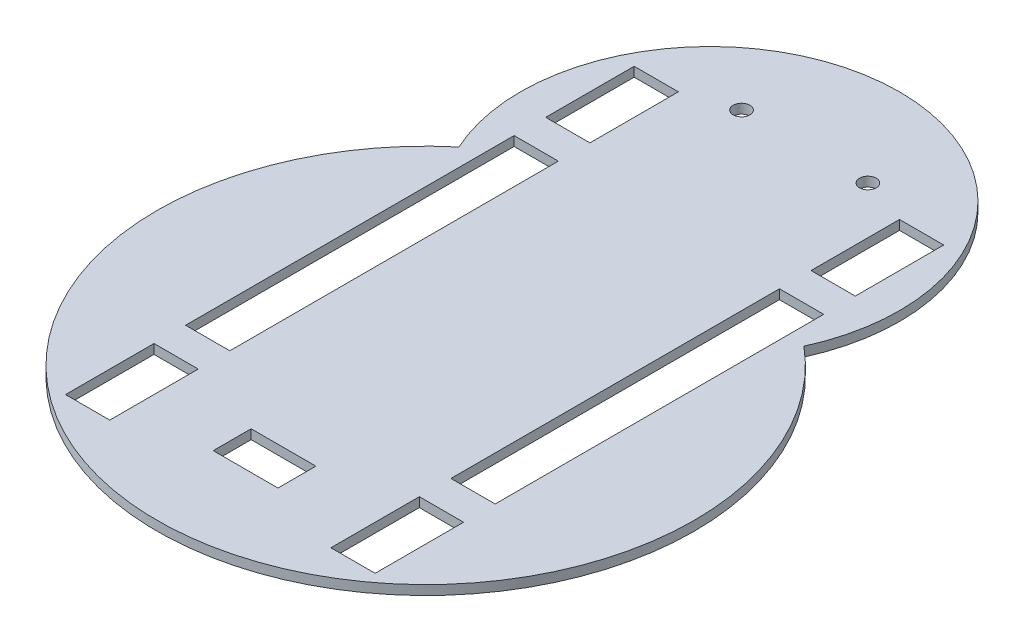
ISO-10303-21;
HEADER;
FILE_DESCRIPTION(('STEP AP214'),'2;1');
FILE_NAME('part.step','',(''),(''),'','','');
FILE_SCHEMA(('AUTOMOTIVE_DESIGN { 1 0 10303 214 1 1 1 1 }'));
ENDSEC;
DATA;
#1=APPLICATION_CONTEXT('core data for automotive mechanical design processes');
#2=APPLICATION_PROTOCOL_DEFINITION('international standard','automotive_design',2000,#1);
#3=PRODUCT_CONTEXT('',#1,'mechanical');
#4=PRODUCT('Part','Part','',(#3));
#5=PRODUCT_RELATED_PRODUCT_CATEGORY('part','',(#4));
#6=PRODUCT_DEFINITION_FORMATION('','',#4);
#7=PRODUCT_DEFINITION_CONTEXT('part definition',#1,'design');
#8=PRODUCT_DEFINITION('design','',#6,#7);
#9=PRODUCT_DEFINITION_SHAPE('','',#8);
#10=(LENGTH_UNIT() NAMED_UNIT(*) SI_UNIT(.MILLI.,.METRE.));
#11=(NAMED_UNIT(*) PLANE_ANGLE_UNIT() SI_UNIT($,.RADIAN.));
#12=(NAMED_UNIT(*) SI_UNIT($,.STERADIAN.) SOLID_ANGLE_UNIT());
#13=UNCERTAINTY_MEASURE_WITH_UNIT(LENGTH_MEASURE(1.E-05),#10,'distance_accuracy_value','');
#14=(GEOMETRIC_REPRESENTATION_CONTEXT(3) GLOBAL_UNCERTAINTY_ASSIGNED_CONTEXT((#13)) GLOBAL_UNIT_ASSIGNED_CONTEXT((#10,
#11,#12)) REPRESENTATION_CONTEXT('',''));
#15=CARTESIAN_POINT('',(0.,0.,0.));
#16=DIRECTION('',(0.,0.,1.));
#17=DIRECTION('',(1.,0.,0.));
#18=AXIS2_PLACEMENT_3D('',#15,#16,#17);
#19=CARTESIAN_POINT('',(-49.,1.5,0.));
#20=DIRECTION('',(-1.,0.,0.));
#21=DIRECTION('',(0.,0.,1.));
#22=AXIS2_PLACEMENT_3D('',#19,#20,#21);
#23=PLANE('',#22);
#24=DIRECTION('',(0.,0.,-1.));
#25=VECTOR('',#24,1.);
#26=CARTESIAN_POINT('',(-49.,1.5,0.));
#27=LINE('',#26,#25);
#28=CARTESIAN_POINT('',(-49.,1.5,27.));
#29=VERTEX_POINT('',#28);
#30=CARTESIAN_POINT('',(-49.,1.5,-77.));
#31=VERTEX_POINT('',#30);
#32=EDGE_CURVE('E365',#29,#31,#27,.T.);
#33=ORIENTED_EDGE('',*,*,#32,.F.);
#34=DIRECTION('',(0.,-1.,0.));
#35=VECTOR('',#34,1.);
#36=CARTESIAN_POINT('',(-49.,1.5,27.));
#37=LINE('',#36,#35);
#38=CARTESIAN_POINT('',(-49.,-1.5,27.));
#39=VERTEX_POINT('',#38);
#40=EDGE_CURVE('E461',#29,#39,#37,.T.);
#41=ORIENTED_EDGE('',*,*,#40,.T.);
#42=DIRECTION('',(0.,0.,-1.));
#43=VECTOR('',#42,1.);
#44=CARTESIAN_POINT('',(-49.,-1.5,0.));
#45=LINE('',#44,#43);
#46=CARTESIAN_POINT('',(-49.,-1.5,-77.));
#47=VERTEX_POINT('',#46);
#48=EDGE_CURVE('E404',#39,#47,#45,.T.);
#49=ORIENTED_EDGE('',*,*,#48,.T.);
#50=DIRECTION('',(0.,-1.,0.));
#51=VECTOR('',#50,1.);
#52=CARTESIAN_POINT('',(-49.,1.5,-77.));
#53=LINE('',#52,#51);
#54=EDGE_CURVE('E455',#31,#47,#53,.T.);
#55=ORIENTED_EDGE('',*,*,#54,.F.);
#56=EDGE_LOOP('',(#33,#41,#49,#55));
#57=FACE_BOUND('',#56,.T.);
#58=ADVANCED_FACE('F107',(#57),#23,.F.);
#59=CARTESIAN_POINT('',(-49.,1.5,-87.));
#60=VERTEX_POINT('',#59);
#61=CARTESIAN_POINT('',(-49.,1.5,-115.));
#62=VERTEX_POINT('',#61);
#63=EDGE_CURVE('E359',#60,#62,#27,.T.);
#64=ORIENTED_EDGE('',*,*,#63,.F.);
#65=DIRECTION('',(0.,-1.,0.));
#66=VECTOR('',#65,1.);
#67=CARTESIAN_POINT('',(-49.0000000000001,1.5,-87.));
#68=LINE('',#67,#66);
#69=CARTESIAN_POINT('',(-49.,-1.5,-87.));
#70=VERTEX_POINT('',#69);
#71=EDGE_CURVE('E457',#60,#70,#68,.T.);
#72=ORIENTED_EDGE('',*,*,#71,.T.);
#73=CARTESIAN_POINT('',(-49.,-1.5,-115.));
#74=VERTEX_POINT('',#73);
#75=EDGE_CURVE('E398',#70,#74,#45,.T.);
#76=ORIENTED_EDGE('',*,*,#75,.T.);
#77=DIRECTION('',(0.,-1.,0.));
#78=VECTOR('',#77,1.);
#79=CARTESIAN_POINT('',(-49.,1.5,-115.));
#80=LINE('',#79,#78);
#81=EDGE_CURVE('E422',#62,#74,#80,.T.);
#82=ORIENTED_EDGE('',*,*,#81,.F.);
#83=EDGE_LOOP('',(#64,#72,#76,#82));
#84=FACE_BOUND('',#83,.T.);
#85=ADVANCED_FACE('F591',(#84),#23,.F.);
#86=CARTESIAN_POINT('',(0.,1.5,-115.));
#87=DIRECTION('',(0.,0.,-1.));
#88=DIRECTION('',(-1.,0.,0.));
#89=AXIS2_PLACEMENT_3D('',#86,#87,#88);
#90=PLANE('',#89);
#91=DIRECTION('',(1.,0.,0.));
#92=VECTOR('',#91,1.);
#93=CARTESIAN_POINT('',(0.,-1.5,-115.));
#94=LINE('',#93,#92);
#95=CARTESIAN_POINT('',(-35.,-1.5,-115.));
#96=VERTEX_POINT('',#95);
#97=EDGE_CURVE('E403',#74,#96,#94,.T.);
#98=ORIENTED_EDGE('',*,*,#97,.T.);
#99=DIRECTION('',(0.,-1.,0.));
#100=VECTOR('',#99,1.);
#101=CARTESIAN_POINT('',(-35.,1.5,-115.));
#102=LINE('',#101,#100);
#103=CARTESIAN_POINT('',(-35.,1.5,-115.));
#104=VERTEX_POINT('',#103);
#105=EDGE_CURVE('E419',#104,#96,#102,.T.);
#106=ORIENTED_EDGE('',*,*,#105,.F.);
#107=DIRECTION('',(1.,0.,0.));
#108=VECTOR('',#107,1.);
#109=CARTESIAN_POINT('',(0.,1.5,-115.));
#110=LINE('',#109,#108);
#111=EDGE_CURVE('E364',#62,#104,#110,.T.);
#112=ORIENTED_EDGE('',*,*,#111,.F.);
#113=ORIENTED_EDGE('',*,*,#81,.T.);
#114=EDGE_LOOP('',(#98,#106,#112,#113));
#115=FACE_BOUND('',#114,.T.);
#116=ADVANCED_FACE('F590',(#115),#90,.F.);
#117=CARTESIAN_POINT('',(-35.,1.5,0.));
#118=DIRECTION('',(-1.,0.,0.));
#119=DIRECTION('',(0.,0.,1.));
#120=AXIS2_PLACEMENT_3D('',#117,#118,#119);
#121=PLANE('',#120);
#122=DIRECTION('',(0.,-1.,0.));
#123=VECTOR('',#122,1.);
#124=CARTESIAN_POINT('',(-35.,1.5,-87.));
#125=LINE('',#124,#123);
#126=CARTESIAN_POINT('',(-35.,1.5,-87.));
#127=VERTEX_POINT('',#126);
#128=CARTESIAN_POINT('',(-35.,-1.5,-87.));
#129=VERTEX_POINT('',#128);
#130=EDGE_CURVE('E478',#127,#129,#125,.T.);
#131=ORIENTED_EDGE('',*,*,#130,.F.);
#132=DIRECTION('',(0.,0.,-1.));
#133=VECTOR('',#132,1.);
#134=CARTESIAN_POINT('',(-35.,1.5,0.));
#135=LINE('',#134,#133);
#136=EDGE_CURVE('E368',#127,#104,#135,.T.);
#137=ORIENTED_EDGE('',*,*,#136,.T.);
#138=ORIENTED_EDGE('',*,*,#105,.T.);
#139=DIRECTION('',(0.,0.,-1.));
#140=VECTOR('',#139,1.);
#141=CARTESIAN_POINT('',(-35.,-1.5,0.));
#142=LINE('',#141,#140);
#143=EDGE_CURVE('E407',#129,#96,#142,.T.);
#144=ORIENTED_EDGE('',*,*,#143,.F.);
#145=EDGE_LOOP('',(#131,#137,#138,#144));
#146=FACE_BOUND('',#145,.T.);
#147=ADVANCED_FACE('F599',(#146),#121,.T.);
#148=DIRECTION('',(0.,-1.,0.));
#149=VECTOR('',#148,1.);
#150=CARTESIAN_POINT('',(-35.,1.5,27.));
#151=LINE('',#150,#149);
#152=CARTESIAN_POINT('',(-35.,1.5,27.));
#153=VERTEX_POINT('',#152);
#154=CARTESIAN_POINT('',(-35.,-1.5,27.));
#155=VERTEX_POINT('',#154);
#156=EDGE_CURVE('E458',#153,#155,#151,.T.);
#157=ORIENTED_EDGE('',*,*,#156,.F.);
#158=CARTESIAN_POINT('',(-35.,1.5,-77.));
#159=VERTEX_POINT('',#158);
#160=EDGE_CURVE('E373',#153,#159,#135,.T.);
#161=ORIENTED_EDGE('',*,*,#160,.T.);
#162=DIRECTION('',(0.,-1.,0.));
#163=VECTOR('',#162,1.);
#164=CARTESIAN_POINT('',(-35.,1.5,-77.));
#165=LINE('',#164,#163);
#166=CARTESIAN_POINT('',(-35.,-1.5,-77.));
#167=VERTEX_POINT('',#166);
#168=EDGE_CURVE('E454',#159,#167,#165,.T.);
#169=ORIENTED_EDGE('',*,*,#168,.T.);
#170=EDGE_CURVE('E411',#155,#167,#142,.T.);
#171=ORIENTED_EDGE('',*,*,#170,.F.);
#172=EDGE_LOOP('',(#157,#161,#169,#171));
#173=FACE_BOUND('',#172,.T.);
#174=ADVANCED_FACE('F631',(#173),#121,.T.);
#175=CARTESIAN_POINT('',(-35.,1.5,65.));
#176=VERTEX_POINT('',#175);
#177=CARTESIAN_POINT('',(-35.,1.5,37.));
#178=VERTEX_POINT('',#177);
#179=EDGE_CURVE('E369',#176,#178,#135,.T.);
#180=ORIENTED_EDGE('',*,*,#179,.T.);
#181=DIRECTION('',(0.,-1.,0.));
#182=VECTOR('',#181,1.);
#183=CARTESIAN_POINT('',(-35.,1.5,37.));
#184=LINE('',#183,#182);
#185=CARTESIAN_POINT('',(-35.,-1.5,37.));
#186=VERTEX_POINT('',#185);
#187=EDGE_CURVE('E476',#178,#186,#184,.T.);
#188=ORIENTED_EDGE('',*,*,#187,.T.);
#189=CARTESIAN_POINT('',(-35.,-1.5,65.));
#190=VERTEX_POINT('',#189);
#191=EDGE_CURVE('E408',#190,#186,#142,.T.);
#192=ORIENTED_EDGE('',*,*,#191,.F.);
#193=DIRECTION('',(0.,-1.,0.));
#194=VECTOR('',#193,1.);
#195=CARTESIAN_POINT('',(-35.,1.5,65.));
#196=LINE('',#195,#194);
#197=EDGE_CURVE('E416',#176,#190,#196,.T.);
#198=ORIENTED_EDGE('',*,*,#197,.F.);
#199=EDGE_LOOP('',(#180,#188,#192,#198));
#200=FACE_BOUND('',#199,.T.);
#201=ADVANCED_FACE('F614',(#200),#121,.T.);
#202=CARTESIAN_POINT('',(0.,1.5,65.));
#203=DIRECTION('',(0.,0.,-1.));
#204=DIRECTION('',(-1.,0.,0.));
#205=AXIS2_PLACEMENT_3D('',#202,#203,#204);
#206=PLANE('',#205);
#207=DIRECTION('',(1.,0.,0.));
#208=VECTOR('',#207,1.);
#209=CARTESIAN_POINT('',(0.,-1.5,65.));
#210=LINE('',#209,#208);
#211=CARTESIAN_POINT('',(-49.,-1.5,65.));
#212=VERTEX_POINT('',#211);
#213=EDGE_CURVE('E342',#212,#190,#210,.T.);
#214=ORIENTED_EDGE('',*,*,#213,.F.);
#215=DIRECTION('',(0.,-1.,0.));
#216=VECTOR('',#215,1.);
#217=CARTESIAN_POINT('',(-49.,1.5,65.));
#218=LINE('',#217,#216);
#219=CARTESIAN_POINT('',(-49.,1.5,65.));
#220=VERTEX_POINT('',#219);
#221=EDGE_CURVE('E414',#220,#212,#218,.T.);
#222=ORIENTED_EDGE('',*,*,#221,.F.);
#223=DIRECTION('',(1.,0.,0.));
#224=VECTOR('',#223,1.);
#225=CARTESIAN_POINT('',(0.,1.5,65.));
#226=LINE('',#225,#224);
#227=EDGE_CURVE('E372',#220,#176,#226,.T.);
#228=ORIENTED_EDGE('',*,*,#227,.T.);
#229=ORIENTED_EDGE('',*,*,#197,.T.);
#230=EDGE_LOOP('',(#214,#222,#228,#229));
#231=FACE_BOUND('',#230,.T.);
#232=ADVANCED_FACE('F604',(#231),#206,.T.);
#233=DIRECTION('',(0.,-1.,0.));
#234=VECTOR('',#233,1.);
#235=CARTESIAN_POINT('',(-49.,1.5,37.));
#236=LINE('',#235,#234);
#237=CARTESIAN_POINT('',(-49.,1.5,37.));
#238=VERTEX_POINT('',#237);
#239=CARTESIAN_POINT('',(-49.,-1.5,37.));
#240=VERTEX_POINT('',#239);
#241=EDGE_CURVE('E459',#238,#240,#236,.T.);
#242=ORIENTED_EDGE('',*,*,#241,.F.);
#243=EDGE_CURVE('E361',#220,#238,#27,.T.);
#244=ORIENTED_EDGE('',*,*,#243,.F.);
#245=ORIENTED_EDGE('',*,*,#221,.T.);
#246=EDGE_CURVE('E400',#212,#240,#45,.T.);
#247=ORIENTED_EDGE('',*,*,#246,.T.);
#248=EDGE_LOOP('',(#242,#244,#245,#247));
#249=FACE_BOUND('',#248,.T.);
#250=ADVANCED_FACE('F594',(#249),#23,.F.);
#251=CARTESIAN_POINT('',(49.,1.5,0.));
#252=DIRECTION('',(-1.,0.,0.));
#253=DIRECTION('',(0.,0.,1.));
#254=AXIS2_PLACEMENT_3D('',#251,#252,#253);
#255=PLANE('',#254);
#256=DIRECTION('',(0.,0.,-1.));
#257=VECTOR('',#256,1.);
#258=CARTESIAN_POINT('',(49.,-1.5,0.));
#259=LINE('',#258,#257);
#260=CARTESIAN_POINT('',(49.,-1.5,-87.));
#261=VERTEX_POINT('',#260);
#262=CARTESIAN_POINT('',(49.,-1.5,-115.));
#263=VERTEX_POINT('',#262);
#264=EDGE_CURVE('E386',#261,#263,#259,.T.);
#265=ORIENTED_EDGE('',*,*,#264,.F.);
#266=DIRECTION('',(0.,1.,0.));
#267=VECTOR('',#266,1.);
#268=CARTESIAN_POINT('',(49.,1.5,-87.));
#269=LINE('',#268,#267);
#270=CARTESIAN_POINT('',(49.,1.5,-87.));
#271=VERTEX_POINT('',#270);
#272=EDGE_CURVE('E448',#261,#271,#269,.T.);
#273=ORIENTED_EDGE('',*,*,#272,.T.);
#274=DIRECTION('',(0.,0.,-1.));
#275=VECTOR('',#274,1.);
#276=CARTESIAN_POINT('',(49.,1.5,0.));
#277=LINE('',#276,#275);
#278=CARTESIAN_POINT('',(49.,1.5,-115.));
#279=VERTEX_POINT('',#278);
#280=EDGE_CURVE('E347',#271,#279,#277,.T.);
#281=ORIENTED_EDGE('',*,*,#280,.T.);
#282=DIRECTION('',(0.,-1.,0.));
#283=VECTOR('',#282,1.);
#284=CARTESIAN_POINT('',(49.,1.5,-115.));
#285=LINE('',#284,#283);
#286=EDGE_CURVE('E417',#279,#263,#285,.T.);
#287=ORIENTED_EDGE('',*,*,#286,.T.);
#288=EDGE_LOOP('',(#265,#273,#281,#287));
#289=FACE_BOUND('',#288,.T.);
#290=ADVANCED_FACE('F603',(#289),#255,.T.);
#291=CARTESIAN_POINT('',(49.,-1.5,27.));
#292=VERTEX_POINT('',#291);
#293=CARTESIAN_POINT('',(49.,-1.5,-77.));
#294=VERTEX_POINT('',#293);
#295=EDGE_CURVE('E391',#292,#294,#259,.T.);
#296=ORIENTED_EDGE('',*,*,#295,.F.);
#297=DIRECTION('',(0.,1.,0.));
#298=VECTOR('',#297,1.);
#299=CARTESIAN_POINT('',(49.,1.5,27.));
#300=LINE('',#299,#298);
#301=CARTESIAN_POINT('',(49.,1.5,27.));
#302=VERTEX_POINT('',#301);
#303=EDGE_CURVE('E452',#292,#302,#300,.T.);
#304=ORIENTED_EDGE('',*,*,#303,.T.);
#305=CARTESIAN_POINT('',(49.,1.5,-77.));
#306=VERTEX_POINT('',#305);
#307=EDGE_CURVE('E352',#302,#306,#277,.T.);
#308=ORIENTED_EDGE('',*,*,#307,.T.);
#309=DIRECTION('',(0.,1.,0.));
#310=VECTOR('',#309,1.);
#311=CARTESIAN_POINT('',(49.,1.5,-77.));
#312=LINE('',#311,#310);
#313=EDGE_CURVE('E446',#294,#306,#312,.T.);
#314=ORIENTED_EDGE('',*,*,#313,.F.);
#315=EDGE_LOOP('',(#296,#304,#308,#314));
#316=FACE_BOUND('',#315,.T.);
#317=ADVANCED_FACE('F610',(#316),#255,.T.);
#318=DIRECTION('',(0.,1.,0.));
#319=VECTOR('',#318,1.);
#320=CARTESIAN_POINT('',(49.,1.5,37.));
#321=LINE('',#320,#319);
#322=CARTESIAN_POINT('',(49.,-1.5,37.));
#323=VERTEX_POINT('',#322);
#324=CARTESIAN_POINT('',(49.,1.5,37.));
#325=VERTEX_POINT('',#324);
#326=EDGE_CURVE('E450',#323,#325,#321,.T.);
#327=ORIENTED_EDGE('',*,*,#326,.F.);
#328=CARTESIAN_POINT('',(49.,-1.5,65.));
#329=VERTEX_POINT('',#328);
#330=EDGE_CURVE('E387',#329,#323,#259,.T.);
#331=ORIENTED_EDGE('',*,*,#330,.F.);
#332=DIRECTION('',(0.,-1.,0.));
#333=VECTOR('',#332,1.);
#334=CARTESIAN_POINT('',(49.,1.5,65.));
#335=LINE('',#334,#333);
#336=CARTESIAN_POINT('',(49.,1.5,65.));
#337=VERTEX_POINT('',#336);
#338=EDGE_CURVE('E433',#337,#329,#335,.T.);
#339=ORIENTED_EDGE('',*,*,#338,.F.);
#340=EDGE_CURVE('E348',#337,#325,#277,.T.);
#341=ORIENTED_EDGE('',*,*,#340,.T.);
#342=EDGE_LOOP('',(#327,#331,#339,#341));
#343=FACE_BOUND('',#342,.T.);
#344=ADVANCED_FACE('F613',(#343),#255,.T.);
#345=CARTESIAN_POINT('',(0.,1.5,65.));
#346=DIRECTION('',(0.,0.,1.));
#347=DIRECTION('',(1.,0.,0.));
#348=AXIS2_PLACEMENT_3D('',#345,#346,#347);
#349=PLANE('',#348);
#350=DIRECTION('',(-1.,0.,0.));
#351=VECTOR('',#350,1.);
#352=CARTESIAN_POINT('',(0.,-1.5,65.));
#353=LINE('',#352,#351);
#354=CARTESIAN_POINT('',(35.,-1.5,65.));
#355=VERTEX_POINT('',#354);
#356=EDGE_CURVE('E390',#329,#355,#353,.T.);
#357=ORIENTED_EDGE('',*,*,#356,.T.);
#358=DIRECTION('',(0.,-1.,0.));
#359=VECTOR('',#358,1.);
#360=CARTESIAN_POINT('',(35.,1.5,65.));
#361=LINE('',#360,#359);
#362=CARTESIAN_POINT('',(35.,1.5,65.));
#363=VERTEX_POINT('',#362);
#364=EDGE_CURVE('E429',#363,#355,#361,.T.);
#365=ORIENTED_EDGE('',*,*,#364,.F.);
#366=DIRECTION('',(-1.,0.,0.));
#367=VECTOR('',#366,1.);
#368=CARTESIAN_POINT('',(0.,1.5,65.));
#369=LINE('',#368,#367);
#370=EDGE_CURVE('E351',#337,#363,#369,.T.);
#371=ORIENTED_EDGE('',*,*,#370,.F.);
#372=ORIENTED_EDGE('',*,*,#338,.T.);
#373=EDGE_LOOP('',(#357,#365,#371,#372));
#374=FACE_BOUND('',#373,.T.);
#375=ADVANCED_FACE('F724',(#374),#349,.F.);
#376=CARTESIAN_POINT('',(35.,1.5,0.));
#377=DIRECTION('',(-1.,0.,0.));
#378=DIRECTION('',(0.,0.,1.));
#379=AXIS2_PLACEMENT_3D('',#376,#377,#378);
#380=PLANE('',#379);
#381=DIRECTION('',(0.,0.,-1.));
#382=VECTOR('',#381,1.);
#383=CARTESIAN_POINT('',(35.,-1.5,0.));
#384=LINE('',#383,#382);
#385=CARTESIAN_POINT('',(35.,-1.5,37.));
#386=VERTEX_POINT('',#385);
#387=EDGE_CURVE('E395',#355,#386,#384,.T.);
#388=ORIENTED_EDGE('',*,*,#387,.T.);
#389=DIRECTION('',(0.,1.,0.));
#390=VECTOR('',#389,1.);
#391=CARTESIAN_POINT('',(35.,1.5,37.));
#392=LINE('',#391,#390);
#393=CARTESIAN_POINT('',(35.,1.5,37.));
#394=VERTEX_POINT('',#393);
#395=EDGE_CURVE('E443',#386,#394,#392,.T.);
#396=ORIENTED_EDGE('',*,*,#395,.T.);
#397=DIRECTION('',(0.,0.,-1.));
#398=VECTOR('',#397,1.);
#399=CARTESIAN_POINT('',(35.,1.5,0.));
#400=LINE('',#399,#398);
#401=EDGE_CURVE('E356',#363,#394,#400,.T.);
#402=ORIENTED_EDGE('',*,*,#401,.F.);
#403=ORIENTED_EDGE('',*,*,#364,.T.);
#404=EDGE_LOOP('',(#388,#396,#402,#403));
#405=FACE_BOUND('',#404,.T.);
#406=ADVANCED_FACE('F727',(#405),#380,.F.);
#407=CARTESIAN_POINT('',(35.,1.5,27.));
#408=VERTEX_POINT('',#407);
#409=CARTESIAN_POINT('',(35.,1.5,-77.));
#410=VERTEX_POINT('',#409);
#411=EDGE_CURVE('E360',#408,#410,#400,.T.);
#412=ORIENTED_EDGE('',*,*,#411,.F.);
#413=DIRECTION('',(0.,-1.,0.));
#414=VECTOR('',#413,1.);
#415=CARTESIAN_POINT('',(35.,1.5,27.));
#416=LINE('',#415,#414);
#417=CARTESIAN_POINT('',(35.,-1.5,27.));
#418=VERTEX_POINT('',#417);
#419=EDGE_CURVE('E445',#408,#418,#416,.T.);
#420=ORIENTED_EDGE('',*,*,#419,.T.);
#421=CARTESIAN_POINT('',(35.,-1.5,-77.));
#422=VERTEX_POINT('',#421);
#423=EDGE_CURVE('E399',#418,#422,#384,.T.);
#424=ORIENTED_EDGE('',*,*,#423,.T.);
#425=DIRECTION('',(0.,1.,0.));
#426=VECTOR('',#425,1.);
#427=CARTESIAN_POINT('',(35.,1.5,-77.));
#428=LINE('',#427,#426);
#429=EDGE_CURVE('E425',#422,#410,#428,.T.);
#430=ORIENTED_EDGE('',*,*,#429,.T.);
#431=EDGE_LOOP('',(#412,#420,#424,#430));
#432=FACE_BOUND('',#431,.T.);
#433=ADVANCED_FACE('F693',(#432),#380,.F.);
#434=CARTESIAN_POINT('',(35.,1.5,-87.));
#435=VERTEX_POINT('',#434);
#436=CARTESIAN_POINT('',(35.,1.5,-115.));
#437=VERTEX_POINT('',#436);
#438=EDGE_CURVE('E355',#435,#437,#400,.T.);
#439=ORIENTED_EDGE('',*,*,#438,.F.);
#440=DIRECTION('',(0.,-1.,0.));
#441=VECTOR('',#440,1.);
#442=CARTESIAN_POINT('',(35.,1.5,-87.));
#443=LINE('',#442,#441);
#444=CARTESIAN_POINT('',(35.,-1.5,-87.));
#445=VERTEX_POINT('',#444);
#446=EDGE_CURVE('E442',#435,#445,#443,.T.);
#447=ORIENTED_EDGE('',*,*,#446,.T.);
#448=CARTESIAN_POINT('',(35.,-1.5,-115.));
#449=VERTEX_POINT('',#448);
#450=EDGE_CURVE('E394',#445,#449,#384,.T.);
#451=ORIENTED_EDGE('',*,*,#450,.T.);
#452=DIRECTION('',(0.,-1.,0.));
#453=VECTOR('',#452,1.);
#454=CARTESIAN_POINT('',(35.,1.5,-115.));
#455=LINE('',#454,#453);
#456=EDGE_CURVE('E426',#437,#449,#455,.T.);
#457=ORIENTED_EDGE('',*,*,#456,.F.);
#458=EDGE_LOOP('',(#439,#447,#451,#457));
#459=FACE_BOUND('',#458,.T.);
#460=ADVANCED_FACE('F690',(#459),#380,.F.);
#461=CARTESIAN_POINT('',(0.,1.5,-115.));
#462=DIRECTION('',(0.,0.,1.));
#463=DIRECTION('',(1.,0.,0.));
#464=AXIS2_PLACEMENT_3D('',#461,#462,#463);
#465=PLANE('',#464);
#466=DIRECTION('',(-1.,0.,0.));
#467=VECTOR('',#466,1.);
#468=CARTESIAN_POINT('',(0.,-1.5,-115.));
#469=LINE('',#468,#467);
#470=EDGE_CURVE('E383',#263,#449,#469,.T.);
#471=ORIENTED_EDGE('',*,*,#470,.F.);
#472=ORIENTED_EDGE('',*,*,#286,.F.);
#473=DIRECTION('',(-1.,0.,0.));
#474=VECTOR('',#473,1.);
#475=CARTESIAN_POINT('',(0.,1.5,-115.));
#476=LINE('',#475,#474);
#477=EDGE_CURVE('E344',#279,#437,#476,.T.);
#478=ORIENTED_EDGE('',*,*,#477,.T.);
#479=ORIENTED_EDGE('',*,*,#456,.T.);
#480=EDGE_LOOP('',(#471,#472,#478,#479));
#481=FACE_BOUND('',#480,.T.);
#482=ADVANCED_FACE('F686',(#481),#465,.T.);
#483=CARTESIAN_POINT('',(0.,1.5,0.));
#484=DIRECTION('',(0.,-1.,0.));
#485=DIRECTION('',(0.,0.,-1.));
#486=AXIS2_PLACEMENT_3D('',#483,#484,#485);
#487=CYLINDRICAL_SURFACE('',#486,85.);
#488=CARTESIAN_POINT('',(0.,-1.5,0.));
#489=DIRECTION('',(0.,1.,0.));
#490=DIRECTION('',(0.,0.,1.));
#491=AXIS2_PLACEMENT_3D('',#488,#489,#490);
#492=CIRCLE('',#491,85.);
#493=CARTESIAN_POINT('',(-54.607006458155,-1.5,-65.1388888888889));
#494=VERTEX_POINT('',#493);
#495=CARTESIAN_POINT('',(54.607006458155,-1.5,-65.1388888888889));
#496=VERTEX_POINT('',#495);
#497=EDGE_CURVE('E380',#494,#496,#492,.T.);
#498=ORIENTED_EDGE('',*,*,#497,.T.);
#499=DIRECTION('',(0.,-1.,0.));
#500=VECTOR('',#499,1.);
#501=CARTESIAN_POINT('',(54.607006458155,1.5,-65.1388888888889));
#502=LINE('',#501,#500);
#503=CARTESIAN_POINT('',(54.607006458155,1.5,-65.1388888888889));
#504=VERTEX_POINT('',#503);
#505=EDGE_CURVE('E376',#504,#496,#502,.T.);
#506=ORIENTED_EDGE('',*,*,#505,.F.);
#507=CARTESIAN_POINT('',(0.,1.5,0.));
#508=DIRECTION('',(0.,1.,0.));
#509=DIRECTION('',(0.,0.,1.));
#510=AXIS2_PLACEMENT_3D('',#507,#508,#509);
#511=CIRCLE('',#510,85.);
#512=CARTESIAN_POINT('',(-54.607006458155,1.5,-65.1388888888889));
#513=VERTEX_POINT('',#512);
#514=EDGE_CURVE('E341',#513,#504,#511,.T.);
#515=ORIENTED_EDGE('',*,*,#514,.F.);
#516=DIRECTION('',(0.,-1.,0.));
#517=VECTOR('',#516,1.);
#518=CARTESIAN_POINT('',(-54.607006458155,1.5,-65.1388888888889));
#519=LINE('',#518,#517);
#520=EDGE_CURVE('E430',#513,#494,#519,.T.);
#521=ORIENTED_EDGE('',*,*,#520,.T.);
#522=EDGE_LOOP('',(#498,#506,#515,#521));
#523=FACE_BOUND('',#522,.T.);
#524=ADVANCED_FACE('F712',(#523),#487,.T.);
#525=CARTESIAN_POINT('',(0.,1.5,-90.));
#526=DIRECTION('',(0.,-1.,0.));
#527=DIRECTION('',(0.,0.,-1.));
#528=AXIS2_PLACEMENT_3D('',#525,#526,#527);
#529=CYLINDRICAL_SURFACE('',#528,60.);
#530=CARTESIAN_POINT('',(0.,-1.5,-90.));
#531=DIRECTION('',(0.,1.,0.));
#532=DIRECTION('',(0.,0.,1.));
#533=AXIS2_PLACEMENT_3D('',#530,#531,#532);
#534=CIRCLE('',#533,60.);
#535=EDGE_CURVE('E377',#496,#494,#534,.T.);
#536=ORIENTED_EDGE('',*,*,#535,.T.);
#537=ORIENTED_EDGE('',*,*,#520,.F.);
#538=CARTESIAN_POINT('',(0.,1.5,-90.));
#539=DIRECTION('',(0.,1.,0.));
#540=DIRECTION('',(0.,0.,1.));
#541=AXIS2_PLACEMENT_3D('',#538,#539,#540);
#542=CIRCLE('',#541,60.);
#543=EDGE_CURVE('E338',#504,#513,#542,.T.);
#544=ORIENTED_EDGE('',*,*,#543,.F.);
#545=ORIENTED_EDGE('',*,*,#505,.T.);
#546=EDGE_LOOP('',(#536,#537,#544,#545));
#547=FACE_BOUND('',#546,.T.);
#548=ADVANCED_FACE('F707',(#547),#529,.T.);
#549=CARTESIAN_POINT('',(0.,-1.5,0.));
#550=DIRECTION('',(0.,1.,0.));
#551=DIRECTION('',(0.,0.,1.));
#552=AXIS2_PLACEMENT_3D('',#549,#550,#551);
#553=PLANE('',#552);
#554=DIRECTION('',(1.,0.,0.));
#555=VECTOR('',#554,1.);
#556=CARTESIAN_POINT('',(-10.25,-1.5,45.));
#557=LINE('',#556,#555);
#558=CARTESIAN_POINT('',(-10.25,-1.5,45.));
#559=VERTEX_POINT('',#558);
#560=CARTESIAN_POINT('',(10.25,-1.5,45.));
#561=VERTEX_POINT('',#560);
#562=EDGE_CURVE('E315',#559,#561,#557,.T.);
#563=ORIENTED_EDGE('',*,*,#562,.F.);
#564=DIRECTION('',(0.,0.,-1.));
#565=VECTOR('',#564,1.);
#566=CARTESIAN_POINT('',(-10.25,-1.5,57.));
#567=LINE('',#566,#565);
#568=CARTESIAN_POINT('',(-10.25,-1.5,57.));
#569=VERTEX_POINT('',#568);
#570=EDGE_CURVE('E122',#569,#559,#567,.T.);
#571=ORIENTED_EDGE('',*,*,#570,.F.);
#572=DIRECTION('',(-1.,0.,0.));
#573=VECTOR('',#572,1.);
#574=CARTESIAN_POINT('',(-10.25,-1.5,57.));
#575=LINE('',#574,#573);
#576=CARTESIAN_POINT('',(10.25,-1.5,57.));
#577=VERTEX_POINT('',#576);
#578=EDGE_CURVE('E322',#577,#569,#575,.T.);
#579=ORIENTED_EDGE('',*,*,#578,.F.);
#580=DIRECTION('',(0.,0.,1.));
#581=VECTOR('',#580,1.);
#582=CARTESIAN_POINT('',(10.25,-1.5,57.));
#583=LINE('',#582,#581);
#584=EDGE_CURVE('E306',#561,#577,#583,.T.);
#585=ORIENTED_EDGE('',*,*,#584,.F.);
#586=EDGE_LOOP('',(#563,#571,#579,#585));
#587=FACE_BOUND('',#586,.T.);
#588=CARTESIAN_POINT('',(-20.,-1.5,-120.));
#589=DIRECTION('',(0.,-1.,0.));
#590=DIRECTION('',(0.,0.,-1.));
#591=AXIS2_PLACEMENT_3D('',#588,#589,#590);
#592=CIRCLE('',#591,2.65);
#593=CARTESIAN_POINT('',(-20.,-1.5,-122.65));
#594=VERTEX_POINT('',#593);
#595=EDGE_CURVE('E332',#594,#594,#592,.T.);
#596=ORIENTED_EDGE('',*,*,#595,.F.);
#597=EDGE_LOOP('',(#596));
#598=FACE_BOUND('',#597,.T.);
#599=CARTESIAN_POINT('',(20.,-1.5,-120.));
#600=DIRECTION('',(0.,-1.,0.));
#601=DIRECTION('',(0.,0.,-1.));
#602=AXIS2_PLACEMENT_3D('',#599,#600,#601);
#603=CIRCLE('',#602,2.65);
#604=CARTESIAN_POINT('',(20.,-1.5,-122.65));
#605=VERTEX_POINT('',#604);
#606=EDGE_CURVE('E335',#605,#605,#603,.T.);
#607=ORIENTED_EDGE('',*,*,#606,.F.);
#608=EDGE_LOOP('',(#607));
#609=FACE_BOUND('',#608,.T.);
#610=DIRECTION('',(-1.,0.,0.));
#611=VECTOR('',#610,1.);
#612=CARTESIAN_POINT('',(49.0000000000001,-1.5,-87.));
#613=LINE('',#612,#611);
#614=EDGE_CURVE('E499',#261,#445,#613,.T.);
#615=ORIENTED_EDGE('',*,*,#614,.F.);
#616=ORIENTED_EDGE('',*,*,#264,.T.);
#617=ORIENTED_EDGE('',*,*,#470,.T.);
#618=ORIENTED_EDGE('',*,*,#450,.F.);
#619=EDGE_LOOP('',(#615,#616,#617,#618));
#620=FACE_BOUND('',#619,.T.);
#621=DIRECTION('',(-1.,0.,0.));
#622=VECTOR('',#621,1.);
#623=CARTESIAN_POINT('',(49.,-1.5,27.));
#624=LINE('',#623,#622);
#625=EDGE_CURVE('E486',#292,#418,#624,.T.);
#626=ORIENTED_EDGE('',*,*,#625,.F.);
#627=ORIENTED_EDGE('',*,*,#295,.T.);
#628=DIRECTION('',(-1.,0.,0.));
#629=VECTOR('',#628,1.);
#630=CARTESIAN_POINT('',(49.0000000000001,-1.5,-77.));
#631=LINE('',#630,#629);
#632=EDGE_CURVE('E496',#294,#422,#631,.T.);
#633=ORIENTED_EDGE('',*,*,#632,.T.);
#634=ORIENTED_EDGE('',*,*,#423,.F.);
#635=EDGE_LOOP('',(#626,#627,#633,#634));
#636=FACE_BOUND('',#635,.T.);
#637=ORIENTED_EDGE('',*,*,#75,.F.);
#638=DIRECTION('',(1.,0.,0.));
#639=VECTOR('',#638,1.);
#640=CARTESIAN_POINT('',(-49.0000000000001,-1.5,-87.));
#641=LINE('',#640,#639);
#642=EDGE_CURVE('E512',#70,#129,#641,.T.);
#643=ORIENTED_EDGE('',*,*,#642,.T.);
#644=ORIENTED_EDGE('',*,*,#143,.T.);
#645=ORIENTED_EDGE('',*,*,#97,.F.);
#646=EDGE_LOOP('',(#637,#643,#644,#645));
#647=FACE_BOUND('',#646,.T.);
#648=ORIENTED_EDGE('',*,*,#48,.F.);
#649=DIRECTION('',(1.,0.,0.));
#650=VECTOR('',#649,1.);
#651=CARTESIAN_POINT('',(-49.,-1.5,27.));
#652=LINE('',#651,#650);
#653=EDGE_CURVE('E468',#39,#155,#652,.T.);
#654=ORIENTED_EDGE('',*,*,#653,.T.);
#655=ORIENTED_EDGE('',*,*,#170,.T.);
#656=DIRECTION('',(1.,0.,0.));
#657=VECTOR('',#656,1.);
#658=CARTESIAN_POINT('',(-49.0000000000001,-1.5,-77.));
#659=LINE('',#658,#657);
#660=EDGE_CURVE('E509',#47,#167,#659,.T.);
#661=ORIENTED_EDGE('',*,*,#660,.F.);
#662=EDGE_LOOP('',(#648,#654,#655,#661));
#663=FACE_BOUND('',#662,.T.);
#664=ORIENTED_EDGE('',*,*,#535,.F.);
#665=ORIENTED_EDGE('',*,*,#497,.F.);
#666=EDGE_LOOP('',(#664,#665));
#667=FACE_BOUND('',#666,.T.);
#668=ORIENTED_EDGE('',*,*,#330,.T.);
#669=DIRECTION('',(-1.,0.,0.));
#670=VECTOR('',#669,1.);
#671=CARTESIAN_POINT('',(49.,-1.5,37.));
#672=LINE('',#671,#670);
#673=EDGE_CURVE('E483',#323,#386,#672,.T.);
#674=ORIENTED_EDGE('',*,*,#673,.T.);
#675=ORIENTED_EDGE('',*,*,#387,.F.);
#676=ORIENTED_EDGE('',*,*,#356,.F.);
#677=EDGE_LOOP('',(#668,#674,#675,#676));
#678=FACE_BOUND('',#677,.T.);
#679=ORIENTED_EDGE('',*,*,#246,.F.);
#680=ORIENTED_EDGE('',*,*,#213,.T.);
#681=ORIENTED_EDGE('',*,*,#191,.T.);
#682=DIRECTION('',(1.,0.,0.));
#683=VECTOR('',#682,1.);
#684=CARTESIAN_POINT('',(-49.,-1.5,37.));
#685=LINE('',#684,#683);
#686=EDGE_CURVE('E465',#240,#186,#685,.T.);
#687=ORIENTED_EDGE('',*,*,#686,.F.);
#688=EDGE_LOOP('',(#679,#680,#681,#687));
#689=FACE_BOUND('',#688,.T.);
#690=ADVANCED_FACE('F319',(#587,#598,#609,#620,#636,#647,#663,#667,#678,#689),#553,.F.);
#691=CARTESIAN_POINT('',(0.,1.5,0.));
#692=DIRECTION('',(0.,1.,0.));
#693=DIRECTION('',(0.,0.,1.));
#694=AXIS2_PLACEMENT_3D('',#691,#692,#693);
#695=PLANE('',#694);
#696=DIRECTION('',(0.,0.,1.));
#697=VECTOR('',#696,1.);
#698=CARTESIAN_POINT('',(-10.25,1.5,0.));
#699=LINE('',#698,#697);
#700=CARTESIAN_POINT('',(-10.25,1.5,45.));
#701=VERTEX_POINT('',#700);
#702=CARTESIAN_POINT('',(-10.25,1.5,57.));
#703=VERTEX_POINT('',#702);
#704=EDGE_CURVE('E12',#701,#703,#699,.T.);
#705=ORIENTED_EDGE('',*,*,#704,.F.);
#706=DIRECTION('',(-1.,0.,0.));
#707=VECTOR('',#706,1.);
#708=CARTESIAN_POINT('',(0.,1.5,45.));
#709=LINE('',#708,#707);
#710=CARTESIAN_POINT('',(10.25,1.5,45.));
#711=VERTEX_POINT('',#710);
#712=EDGE_CURVE('E475',#711,#701,#709,.T.);
#713=ORIENTED_EDGE('',*,*,#712,.F.);
#714=DIRECTION('',(0.,0.,-1.));
#715=VECTOR('',#714,1.);
#716=CARTESIAN_POINT('',(10.25,1.5,0.));
#717=LINE('',#716,#715);
#718=CARTESIAN_POINT('',(10.25,1.5,57.));
#719=VERTEX_POINT('',#718);
#720=EDGE_CURVE('E309',#719,#711,#717,.T.);
#721=ORIENTED_EDGE('',*,*,#720,.F.);
#722=DIRECTION('',(1.,0.,0.));
#723=VECTOR('',#722,1.);
#724=CARTESIAN_POINT('',(0.,1.5,57.));
#725=LINE('',#724,#723);
#726=EDGE_CURVE('E115',#703,#719,#725,.T.);
#727=ORIENTED_EDGE('',*,*,#726,.F.);
#728=EDGE_LOOP('',(#705,#713,#721,#727));
#729=FACE_BOUND('',#728,.T.);
#730=CARTESIAN_POINT('',(-20.,1.5,-120.));
#731=DIRECTION('',(0.,1.,0.));
#732=DIRECTION('',(0.,0.,1.));
#733=AXIS2_PLACEMENT_3D('',#730,#731,#732);
#734=CIRCLE('',#733,2.65);
#735=CARTESIAN_POINT('',(-20.,1.5,-117.35));
#736=VERTEX_POINT('',#735);
#737=EDGE_CURVE('E515',#736,#736,#734,.T.);
#738=ORIENTED_EDGE('',*,*,#737,.F.);
#739=EDGE_LOOP('',(#738));
#740=FACE_BOUND('',#739,.T.);
#741=CARTESIAN_POINT('',(20.,1.5,-120.));
#742=DIRECTION('',(0.,1.,0.));
#743=DIRECTION('',(0.,0.,1.));
#744=AXIS2_PLACEMENT_3D('',#741,#742,#743);
#745=CIRCLE('',#744,2.65);
#746=CARTESIAN_POINT('',(20.,1.5,-117.35));
#747=VERTEX_POINT('',#746);
#748=EDGE_CURVE('E329',#747,#747,#745,.T.);
#749=ORIENTED_EDGE('',*,*,#748,.F.);
#750=EDGE_LOOP('',(#749));
#751=FACE_BOUND('',#750,.T.);
#752=ORIENTED_EDGE('',*,*,#280,.F.);
#753=DIRECTION('',(-1.,0.,0.));
#754=VECTOR('',#753,1.);
#755=CARTESIAN_POINT('',(49.0000000000001,1.5,-87.));
#756=LINE('',#755,#754);
#757=EDGE_CURVE('E493',#271,#435,#756,.T.);
#758=ORIENTED_EDGE('',*,*,#757,.T.);
#759=ORIENTED_EDGE('',*,*,#438,.T.);
#760=ORIENTED_EDGE('',*,*,#477,.F.);
#761=EDGE_LOOP('',(#752,#758,#759,#760));
#762=FACE_BOUND('',#761,.T.);
#763=ORIENTED_EDGE('',*,*,#307,.F.);
#764=DIRECTION('',(-1.,0.,0.));
#765=VECTOR('',#764,1.);
#766=CARTESIAN_POINT('',(49.,1.5,27.));
#767=LINE('',#766,#765);
#768=EDGE_CURVE('E480',#302,#408,#767,.T.);
#769=ORIENTED_EDGE('',*,*,#768,.T.);
#770=ORIENTED_EDGE('',*,*,#411,.T.);
#771=DIRECTION('',(-1.,0.,0.));
#772=VECTOR('',#771,1.);
#773=CARTESIAN_POINT('',(49.0000000000001,1.5,-77.));
#774=LINE('',#773,#772);
#775=EDGE_CURVE('E489',#306,#410,#774,.T.);
#776=ORIENTED_EDGE('',*,*,#775,.F.);
#777=EDGE_LOOP('',(#763,#769,#770,#776));
#778=FACE_BOUND('',#777,.T.);
#779=DIRECTION('',(1.,0.,0.));
#780=VECTOR('',#779,1.);
#781=CARTESIAN_POINT('',(-49.0000000000001,1.5,-87.));
#782=LINE('',#781,#780);
#783=EDGE_CURVE('E506',#60,#127,#782,.T.);
#784=ORIENTED_EDGE('',*,*,#783,.F.);
#785=ORIENTED_EDGE('',*,*,#63,.T.);
#786=ORIENTED_EDGE('',*,*,#111,.T.);
#787=ORIENTED_EDGE('',*,*,#136,.F.);
#788=EDGE_LOOP('',(#784,#785,#786,#787));
#789=FACE_BOUND('',#788,.T.);
#790=DIRECTION('',(1.,0.,0.));
#791=VECTOR('',#790,1.);
#792=CARTESIAN_POINT('',(-49.,1.5,27.));
#793=LINE('',#792,#791);
#794=EDGE_CURVE('E462',#29,#153,#793,.T.);
#795=ORIENTED_EDGE('',*,*,#794,.F.);
#796=ORIENTED_EDGE('',*,*,#32,.T.);
#797=DIRECTION('',(1.,0.,0.));
#798=VECTOR('',#797,1.);
#799=CARTESIAN_POINT('',(-49.0000000000001,1.5,-77.));
#800=LINE('',#799,#798);
#801=EDGE_CURVE('E502',#31,#159,#800,.T.);
#802=ORIENTED_EDGE('',*,*,#801,.T.);
#803=ORIENTED_EDGE('',*,*,#160,.F.);
#804=EDGE_LOOP('',(#795,#796,#802,#803));
#805=FACE_BOUND('',#804,.T.);
#806=ORIENTED_EDGE('',*,*,#543,.T.);
#807=ORIENTED_EDGE('',*,*,#514,.T.);
#808=EDGE_LOOP('',(#806,#807));
#809=FACE_BOUND('',#808,.T.);
#810=DIRECTION('',(-1.,0.,0.));
#811=VECTOR('',#810,1.);
#812=CARTESIAN_POINT('',(49.,1.5,37.));
#813=LINE('',#812,#811);
#814=EDGE_CURVE('E471',#325,#394,#813,.T.);
#815=ORIENTED_EDGE('',*,*,#814,.F.);
#816=ORIENTED_EDGE('',*,*,#340,.F.);
#817=ORIENTED_EDGE('',*,*,#370,.T.);
#818=ORIENTED_EDGE('',*,*,#401,.T.);
#819=EDGE_LOOP('',(#815,#816,#817,#818));
#820=FACE_BOUND('',#819,.T.);
#821=ORIENTED_EDGE('',*,*,#243,.T.);
#822=DIRECTION('',(1.,0.,0.));
#823=VECTOR('',#822,1.);
#824=CARTESIAN_POINT('',(-49.,1.5,37.));
#825=LINE('',#824,#823);
#826=EDGE_CURVE('E381',#238,#178,#825,.T.);
#827=ORIENTED_EDGE('',*,*,#826,.T.);
#828=ORIENTED_EDGE('',*,*,#179,.F.);
#829=ORIENTED_EDGE('',*,*,#227,.F.);
#830=EDGE_LOOP('',(#821,#827,#828,#829));
#831=FACE_BOUND('',#830,.T.);
#832=ADVANCED_FACE('F532',(#729,#740,#751,#762,#778,#789,#805,#809,#820,#831),#695,.T.);
#833=CARTESIAN_POINT('',(-49.0000000000001,1.5,-77.));
#834=DIRECTION('',(0.,0.,-1.));
#835=DIRECTION('',(-1.,0.,0.));
#836=AXIS2_PLACEMENT_3D('',#833,#834,#835);
#837=PLANE('',#836);
#838=ORIENTED_EDGE('',*,*,#660,.T.);
#839=ORIENTED_EDGE('',*,*,#168,.F.);
#840=ORIENTED_EDGE('',*,*,#801,.F.);
#841=ORIENTED_EDGE('',*,*,#54,.T.);
#842=EDGE_LOOP('',(#838,#839,#840,#841));
#843=FACE_BOUND('',#842,.T.);
#844=ADVANCED_FACE('F549',(#843),#837,.F.);
#845=CARTESIAN_POINT('',(-49.0000000000001,1.5,-87.));
#846=DIRECTION('',(0.,0.,-1.));
#847=DIRECTION('',(-1.,0.,0.));
#848=AXIS2_PLACEMENT_3D('',#845,#846,#847);
#849=PLANE('',#848);
#850=ORIENTED_EDGE('',*,*,#642,.F.);
#851=ORIENTED_EDGE('',*,*,#71,.F.);
#852=ORIENTED_EDGE('',*,*,#783,.T.);
#853=ORIENTED_EDGE('',*,*,#130,.T.);
#854=EDGE_LOOP('',(#850,#851,#852,#853));
#855=FACE_BOUND('',#854,.T.);
#856=ADVANCED_FACE('F109',(#855),#849,.T.);
#857=CARTESIAN_POINT('',(49.0000000000001,1.5,-87.));
#858=DIRECTION('',(0.,0.,1.));
#859=DIRECTION('',(1.,0.,0.));
#860=AXIS2_PLACEMENT_3D('',#857,#858,#859);
#861=PLANE('',#860);
#862=ORIENTED_EDGE('',*,*,#614,.T.);
#863=ORIENTED_EDGE('',*,*,#446,.F.);
#864=ORIENTED_EDGE('',*,*,#757,.F.);
#865=ORIENTED_EDGE('',*,*,#272,.F.);
#866=EDGE_LOOP('',(#862,#863,#864,#865));
#867=FACE_BOUND('',#866,.T.);
#868=ADVANCED_FACE('F548',(#867),#861,.F.);
#869=CARTESIAN_POINT('',(49.0000000000001,1.5,-77.));
#870=DIRECTION('',(0.,0.,1.));
#871=DIRECTION('',(1.,0.,0.));
#872=AXIS2_PLACEMENT_3D('',#869,#870,#871);
#873=PLANE('',#872);
#874=ORIENTED_EDGE('',*,*,#632,.F.);
#875=ORIENTED_EDGE('',*,*,#313,.T.);
#876=ORIENTED_EDGE('',*,*,#775,.T.);
#877=ORIENTED_EDGE('',*,*,#429,.F.);
#878=EDGE_LOOP('',(#874,#875,#876,#877));
#879=FACE_BOUND('',#878,.T.);
#880=ADVANCED_FACE('F555',(#879),#873,.T.);
#881=CARTESIAN_POINT('',(49.,1.5,27.));
#882=DIRECTION('',(0.,0.,1.));
#883=DIRECTION('',(1.,0.,0.));
#884=AXIS2_PLACEMENT_3D('',#881,#882,#883);
#885=PLANE('',#884);
#886=ORIENTED_EDGE('',*,*,#625,.T.);
#887=ORIENTED_EDGE('',*,*,#419,.F.);
#888=ORIENTED_EDGE('',*,*,#768,.F.);
#889=ORIENTED_EDGE('',*,*,#303,.F.);
#890=EDGE_LOOP('',(#886,#887,#888,#889));
#891=FACE_BOUND('',#890,.T.);
#892=ADVANCED_FACE('F655',(#891),#885,.F.);
#893=CARTESIAN_POINT('',(49.,1.5,37.));
#894=DIRECTION('',(0.,0.,1.));
#895=DIRECTION('',(1.,0.,0.));
#896=AXIS2_PLACEMENT_3D('',#893,#894,#895);
#897=PLANE('',#896);
#898=ORIENTED_EDGE('',*,*,#673,.F.);
#899=ORIENTED_EDGE('',*,*,#326,.T.);
#900=ORIENTED_EDGE('',*,*,#814,.T.);
#901=ORIENTED_EDGE('',*,*,#395,.F.);
#902=EDGE_LOOP('',(#898,#899,#900,#901));
#903=FACE_BOUND('',#902,.T.);
#904=ADVANCED_FACE('F645',(#903),#897,.T.);
#905=CARTESIAN_POINT('',(-49.,1.5,37.));
#906=DIRECTION('',(0.,0.,-1.));
#907=DIRECTION('',(-1.,0.,0.));
#908=AXIS2_PLACEMENT_3D('',#905,#906,#907);
#909=PLANE('',#908);
#910=ORIENTED_EDGE('',*,*,#686,.T.);
#911=ORIENTED_EDGE('',*,*,#187,.F.);
#912=ORIENTED_EDGE('',*,*,#826,.F.);
#913=ORIENTED_EDGE('',*,*,#241,.T.);
#914=EDGE_LOOP('',(#910,#911,#912,#913));
#915=FACE_BOUND('',#914,.T.);
#916=ADVANCED_FACE('F623',(#915),#909,.F.);
#917=CARTESIAN_POINT('',(-49.,1.5,27.));
#918=DIRECTION('',(0.,0.,-1.));
#919=DIRECTION('',(-1.,0.,0.));
#920=AXIS2_PLACEMENT_3D('',#917,#918,#919);
#921=PLANE('',#920);
#922=ORIENTED_EDGE('',*,*,#653,.F.);
#923=ORIENTED_EDGE('',*,*,#40,.F.);
#924=ORIENTED_EDGE('',*,*,#794,.T.);
#925=ORIENTED_EDGE('',*,*,#156,.T.);
#926=EDGE_LOOP('',(#922,#923,#924,#925));
#927=FACE_BOUND('',#926,.T.);
#928=ADVANCED_FACE('F642',(#927),#921,.T.);
#929=CARTESIAN_POINT('',(20.,8.5,-120.));
#930=DIRECTION('',(0.,-1.,0.));
#931=DIRECTION('',(0.,0.,-1.));
#932=AXIS2_PLACEMENT_3D('',#929,#930,#931);
#933=CYLINDRICAL_SURFACE('',#932,2.65);
#934=ORIENTED_EDGE('',*,*,#748,.T.);
#935=EDGE_LOOP('',(#934));
#936=FACE_BOUND('',#935,.T.);
#937=ORIENTED_EDGE('',*,*,#606,.T.);
#938=EDGE_LOOP('',(#937));
#939=FACE_BOUND('',#938,.T.);
#940=ADVANCED_FACE('F543',(#936,#939),#933,.F.);
#941=CARTESIAN_POINT('',(-20.,8.5,-120.));
#942=DIRECTION('',(0.,-1.,0.));
#943=DIRECTION('',(0.,0.,-1.));
#944=AXIS2_PLACEMENT_3D('',#941,#942,#943);
#945=CYLINDRICAL_SURFACE('',#944,2.65);
#946=ORIENTED_EDGE('',*,*,#737,.T.);
#947=EDGE_LOOP('',(#946));
#948=FACE_BOUND('',#947,.T.);
#949=ORIENTED_EDGE('',*,*,#595,.T.);
#950=EDGE_LOOP('',(#949));
#951=FACE_BOUND('',#950,.T.);
#952=ADVANCED_FACE('F536',(#948,#951),#945,.F.);
#953=CARTESIAN_POINT('',(-10.25,8.5,57.));
#954=DIRECTION('',(-1.,0.,0.));
#955=DIRECTION('',(0.,0.,1.));
#956=AXIS2_PLACEMENT_3D('',#953,#954,#955);
#957=PLANE('',#956);
#958=ORIENTED_EDGE('',*,*,#704,.T.);
#959=DIRECTION('',(0.,-1.,0.));
#960=VECTOR('',#959,1.);
#961=CARTESIAN_POINT('',(-10.25,8.5,57.));
#962=LINE('',#961,#960);
#963=EDGE_CURVE('E327',#703,#569,#962,.T.);
#964=ORIENTED_EDGE('',*,*,#963,.T.);
#965=ORIENTED_EDGE('',*,*,#570,.T.);
#966=DIRECTION('',(0.,-1.,0.));
#967=VECTOR('',#966,1.);
#968=CARTESIAN_POINT('',(-10.25,8.5,45.));
#969=LINE('',#968,#967);
#970=EDGE_CURVE('E312',#701,#559,#969,.T.);
#971=ORIENTED_EDGE('',*,*,#970,.F.);
#972=EDGE_LOOP('',(#958,#964,#965,#971));
#973=FACE_BOUND('',#972,.T.);
#974=ADVANCED_FACE('F534',(#973),#957,.F.);
#975=CARTESIAN_POINT('',(-10.25,8.5,57.));
#976=DIRECTION('',(0.,0.,1.));
#977=DIRECTION('',(1.,0.,0.));
#978=AXIS2_PLACEMENT_3D('',#975,#976,#977);
#979=PLANE('',#978);
#980=ORIENTED_EDGE('',*,*,#726,.T.);
#981=DIRECTION('',(0.,-1.,0.));
#982=VECTOR('',#981,1.);
#983=CARTESIAN_POINT('',(10.25,8.5,57.));
#984=LINE('',#983,#982);
#985=EDGE_CURVE('E311',#719,#577,#984,.T.);
#986=ORIENTED_EDGE('',*,*,#985,.T.);
#987=ORIENTED_EDGE('',*,*,#578,.T.);
#988=ORIENTED_EDGE('',*,*,#963,.F.);
#989=EDGE_LOOP('',(#980,#986,#987,#988));
#990=FACE_BOUND('',#989,.T.);
#991=ADVANCED_FACE('F529',(#990),#979,.F.);
#992=CARTESIAN_POINT('',(10.25,8.5,57.));
#993=DIRECTION('',(1.,0.,0.));
#994=DIRECTION('',(0.,0.,-1.));
#995=AXIS2_PLACEMENT_3D('',#992,#993,#994);
#996=PLANE('',#995);
#997=ORIENTED_EDGE('',*,*,#720,.T.);
#998=DIRECTION('',(0.,-1.,0.));
#999=VECTOR('',#998,1.);
#1000=CARTESIAN_POINT('',(10.25,8.5,45.));
#1001=LINE('',#1000,#999);
#1002=EDGE_CURVE('E130',#711,#561,#1001,.T.);
#1003=ORIENTED_EDGE('',*,*,#1002,.T.);
#1004=ORIENTED_EDGE('',*,*,#584,.T.);
#1005=ORIENTED_EDGE('',*,*,#985,.F.);
#1006=EDGE_LOOP('',(#997,#1003,#1004,#1005));
#1007=FACE_BOUND('',#1006,.T.);
#1008=ADVANCED_FACE('F303',(#1007),#996,.F.);
#1009=CARTESIAN_POINT('',(-10.25,8.5,45.));
#1010=DIRECTION('',(0.,0.,-1.));
#1011=DIRECTION('',(-1.,0.,0.));
#1012=AXIS2_PLACEMENT_3D('',#1009,#1010,#1011);
#1013=PLANE('',#1012);
#1014=ORIENTED_EDGE('',*,*,#712,.T.);
#1015=ORIENTED_EDGE('',*,*,#970,.T.);
#1016=ORIENTED_EDGE('',*,*,#562,.T.);
#1017=ORIENTED_EDGE('',*,*,#1002,.F.);
#1018=EDGE_LOOP('',(#1014,#1015,#1016,#1017));
#1019=FACE_BOUND('',#1018,.T.);
#1020=ADVANCED_FACE('F316',(#1019),#1013,.F.);
#1021=CLOSED_SHELL('',(#58,#85,#116,#147,#174,#201,#232,#250,#290,#317,#344,#375,#406,#433,#460,
#482,#524,#548,#690,#832,#844,#856,#868,#880,#892,#904,#916,#928,#940,#952,#974,#991,#1008,#1020));
#1022=MANIFOLD_SOLID_BREP('B2',#1021);
#1023=ADVANCED_BREP_SHAPE_REPRESENTATION('',(#18,#1022),#14);
#1024=SHAPE_DEFINITION_REPRESENTATION(#9,#1023);
ENDSEC;
END-ISO-10303-21;
